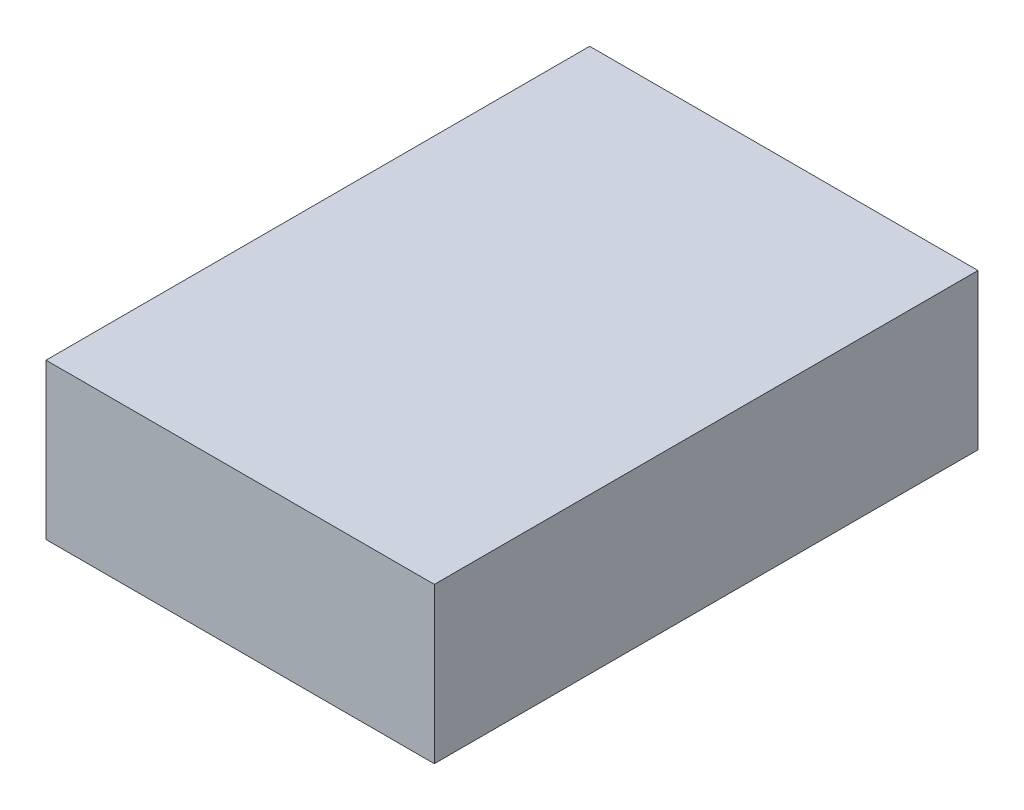
ISO-10303-21;
HEADER;
FILE_DESCRIPTION(('STEP AP214'),'2;1');
FILE_NAME('part.step','',(''),(''),'','','');
FILE_SCHEMA(('AUTOMOTIVE_DESIGN { 1 0 10303 214 1 1 1 1 }'));
ENDSEC;
DATA;
#1=APPLICATION_CONTEXT('core data for automotive mechanical design processes');
#2=APPLICATION_PROTOCOL_DEFINITION('international standard','automotive_design',2000,#1);
#3=PRODUCT_CONTEXT('',#1,'mechanical');
#4=PRODUCT('Part','Part','',(#3));
#5=PRODUCT_RELATED_PRODUCT_CATEGORY('part','',(#4));
#6=PRODUCT_DEFINITION_FORMATION('','',#4);
#7=PRODUCT_DEFINITION_CONTEXT('part definition',#1,'design');
#8=PRODUCT_DEFINITION('design','',#6,#7);
#9=PRODUCT_DEFINITION_SHAPE('','',#8);
#10=(LENGTH_UNIT() NAMED_UNIT(*) SI_UNIT(.MILLI.,.METRE.));
#11=(NAMED_UNIT(*) PLANE_ANGLE_UNIT() SI_UNIT($,.RADIAN.));
#12=(NAMED_UNIT(*) SI_UNIT($,.STERADIAN.) SOLID_ANGLE_UNIT());
#13=UNCERTAINTY_MEASURE_WITH_UNIT(LENGTH_MEASURE(1.E-05),#10,'distance_accuracy_value','');
#14=(GEOMETRIC_REPRESENTATION_CONTEXT(3) GLOBAL_UNCERTAINTY_ASSIGNED_CONTEXT((#13)) GLOBAL_UNIT_ASSIGNED_CONTEXT((#10,
#11,#12)) REPRESENTATION_CONTEXT('',''));
#15=CARTESIAN_POINT('',(0.,0.,0.));
#16=DIRECTION('',(0.,0.,1.));
#17=DIRECTION('',(1.,0.,0.));
#18=AXIS2_PLACEMENT_3D('',#15,#16,#17);
#19=CARTESIAN_POINT('',(12.5,5.,35.));
#20=DIRECTION('',(-1.,0.,0.));
#21=DIRECTION('',(0.,0.,1.));
#22=AXIS2_PLACEMENT_3D('',#19,#20,#21);
#23=PLANE('',#22);
#24=DIRECTION('',(0.,1.,0.));
#25=VECTOR('',#24,1.);
#26=CARTESIAN_POINT('',(12.5,5.,0.));
#27=LINE('',#26,#25);
#28=CARTESIAN_POINT('',(12.5,-5.,0.));
#29=VERTEX_POINT('',#28);
#30=CARTESIAN_POINT('',(12.5,5.,0.));
#31=VERTEX_POINT('',#30);
#32=EDGE_CURVE('E98',#29,#31,#27,.T.);
#33=ORIENTED_EDGE('',*,*,#32,.T.);
#34=DIRECTION('',(0.,0.,-1.));
#35=VECTOR('',#34,1.);
#36=CARTESIAN_POINT('',(12.5,5.,35.));
#37=LINE('',#36,#35);
#38=CARTESIAN_POINT('',(12.5,5.,35.));
#39=VERTEX_POINT('',#38);
#40=EDGE_CURVE('E11',#39,#31,#37,.T.);
#41=ORIENTED_EDGE('',*,*,#40,.F.);
#42=DIRECTION('',(0.,1.,0.));
#43=VECTOR('',#42,1.);
#44=CARTESIAN_POINT('',(12.5,5.,35.));
#45=LINE('',#44,#43);
#46=CARTESIAN_POINT('',(12.5,-5.,35.));
#47=VERTEX_POINT('',#46);
#48=EDGE_CURVE('E86',#47,#39,#45,.T.);
#49=ORIENTED_EDGE('',*,*,#48,.F.);
#50=DIRECTION('',(0.,0.,-1.));
#51=VECTOR('',#50,1.);
#52=CARTESIAN_POINT('',(12.5,-5.,35.));
#53=LINE('',#52,#51);
#54=EDGE_CURVE('E94',#47,#29,#53,.T.);
#55=ORIENTED_EDGE('',*,*,#54,.T.);
#56=EDGE_LOOP('',(#33,#41,#49,#55));
#57=FACE_BOUND('',#56,.T.);
#58=ADVANCED_FACE('F35',(#57),#23,.F.);
#59=CARTESIAN_POINT('',(-12.5,5.,35.));
#60=DIRECTION('',(0.,-1.,0.));
#61=DIRECTION('',(0.,0.,-1.));
#62=AXIS2_PLACEMENT_3D('',#59,#60,#61);
#63=PLANE('',#62);
#64=DIRECTION('',(-1.,0.,0.));
#65=VECTOR('',#64,1.);
#66=CARTESIAN_POINT('',(-12.5,5.,0.));
#67=LINE('',#66,#65);
#68=CARTESIAN_POINT('',(-12.5,5.,0.));
#69=VERTEX_POINT('',#68);
#70=EDGE_CURVE('E90',#31,#69,#67,.T.);
#71=ORIENTED_EDGE('',*,*,#70,.T.);
#72=DIRECTION('',(0.,0.,-1.));
#73=VECTOR('',#72,1.);
#74=CARTESIAN_POINT('',(-12.5,5.,35.));
#75=LINE('',#74,#73);
#76=CARTESIAN_POINT('',(-12.5,5.,35.));
#77=VERTEX_POINT('',#76);
#78=EDGE_CURVE('E43',#77,#69,#75,.T.);
#79=ORIENTED_EDGE('',*,*,#78,.F.);
#80=DIRECTION('',(-1.,0.,0.));
#81=VECTOR('',#80,1.);
#82=CARTESIAN_POINT('',(-12.5,5.,35.));
#83=LINE('',#82,#81);
#84=EDGE_CURVE('E81',#39,#77,#83,.T.);
#85=ORIENTED_EDGE('',*,*,#84,.F.);
#86=ORIENTED_EDGE('',*,*,#40,.T.);
#87=EDGE_LOOP('',(#71,#79,#85,#86));
#88=FACE_BOUND('',#87,.T.);
#89=ADVANCED_FACE('F89',(#88),#63,.F.);
#90=CARTESIAN_POINT('',(-12.5,5.,35.));
#91=DIRECTION('',(1.,0.,0.));
#92=DIRECTION('',(0.,0.,-1.));
#93=AXIS2_PLACEMENT_3D('',#90,#91,#92);
#94=PLANE('',#93);
#95=DIRECTION('',(0.,-1.,0.));
#96=VECTOR('',#95,1.);
#97=CARTESIAN_POINT('',(-12.5,5.,0.));
#98=LINE('',#97,#96);
#99=CARTESIAN_POINT('',(-12.5,-5.,0.));
#100=VERTEX_POINT('',#99);
#101=EDGE_CURVE('E68',#69,#100,#98,.T.);
#102=ORIENTED_EDGE('',*,*,#101,.T.);
#103=DIRECTION('',(0.,0.,-1.));
#104=VECTOR('',#103,1.);
#105=CARTESIAN_POINT('',(-12.5,-5.,35.));
#106=LINE('',#105,#104);
#107=CARTESIAN_POINT('',(-12.5,-5.,35.));
#108=VERTEX_POINT('',#107);
#109=EDGE_CURVE('E91',#108,#100,#106,.T.);
#110=ORIENTED_EDGE('',*,*,#109,.F.);
#111=DIRECTION('',(0.,-1.,0.));
#112=VECTOR('',#111,1.);
#113=CARTESIAN_POINT('',(-12.5,5.,35.));
#114=LINE('',#113,#112);
#115=EDGE_CURVE('E84',#77,#108,#114,.T.);
#116=ORIENTED_EDGE('',*,*,#115,.F.);
#117=ORIENTED_EDGE('',*,*,#78,.T.);
#118=EDGE_LOOP('',(#102,#110,#116,#117));
#119=FACE_BOUND('',#118,.T.);
#120=ADVANCED_FACE('F92',(#119),#94,.F.);
#121=CARTESIAN_POINT('',(-12.5,-5.,35.));
#122=DIRECTION('',(0.,1.,0.));
#123=DIRECTION('',(0.,0.,1.));
#124=AXIS2_PLACEMENT_3D('',#121,#122,#123);
#125=PLANE('',#124);
#126=DIRECTION('',(1.,0.,0.));
#127=VECTOR('',#126,1.);
#128=CARTESIAN_POINT('',(-12.5,-5.,0.));
#129=LINE('',#128,#127);
#130=EDGE_CURVE('E74',#100,#29,#129,.T.);
#131=ORIENTED_EDGE('',*,*,#130,.T.);
#132=ORIENTED_EDGE('',*,*,#54,.F.);
#133=DIRECTION('',(1.,0.,0.));
#134=VECTOR('',#133,1.);
#135=CARTESIAN_POINT('',(-12.5,-5.,35.));
#136=LINE('',#135,#134);
#137=EDGE_CURVE('E51',#108,#47,#136,.T.);
#138=ORIENTED_EDGE('',*,*,#137,.F.);
#139=ORIENTED_EDGE('',*,*,#109,.T.);
#140=EDGE_LOOP('',(#131,#132,#138,#139));
#141=FACE_BOUND('',#140,.T.);
#142=ADVANCED_FACE('F105',(#141),#125,.F.);
#143=CARTESIAN_POINT('',(0.,0.,35.));
#144=DIRECTION('',(0.,0.,1.));
#145=DIRECTION('',(1.,0.,0.));
#146=AXIS2_PLACEMENT_3D('',#143,#144,#145);
#147=PLANE('',#146);
#148=ORIENTED_EDGE('',*,*,#48,.T.);
#149=ORIENTED_EDGE('',*,*,#84,.T.);
#150=ORIENTED_EDGE('',*,*,#115,.T.);
#151=ORIENTED_EDGE('',*,*,#137,.T.);
#152=EDGE_LOOP('',(#148,#149,#150,#151));
#153=FACE_BOUND('',#152,.T.);
#154=ADVANCED_FACE('F82',(#153),#147,.T.);
#155=CARTESIAN_POINT('',(0.,0.,0.));
#156=DIRECTION('',(0.,0.,1.));
#157=DIRECTION('',(1.,0.,0.));
#158=AXIS2_PLACEMENT_3D('',#155,#156,#157);
#159=PLANE('',#158);
#160=ORIENTED_EDGE('',*,*,#32,.F.);
#161=ORIENTED_EDGE('',*,*,#130,.F.);
#162=ORIENTED_EDGE('',*,*,#101,.F.);
#163=ORIENTED_EDGE('',*,*,#70,.F.);
#164=EDGE_LOOP('',(#160,#161,#162,#163));
#165=FACE_BOUND('',#164,.T.);
#166=ADVANCED_FACE('F108',(#165),#159,.F.);
#167=CLOSED_SHELL('',(#58,#89,#120,#142,#154,#166));
#168=MANIFOLD_SOLID_BREP('B2',#167);
#169=ADVANCED_BREP_SHAPE_REPRESENTATION('',(#18,#168),#14);
#170=SHAPE_DEFINITION_REPRESENTATION(#9,#169);
ENDSEC;
END-ISO-10303-21;
